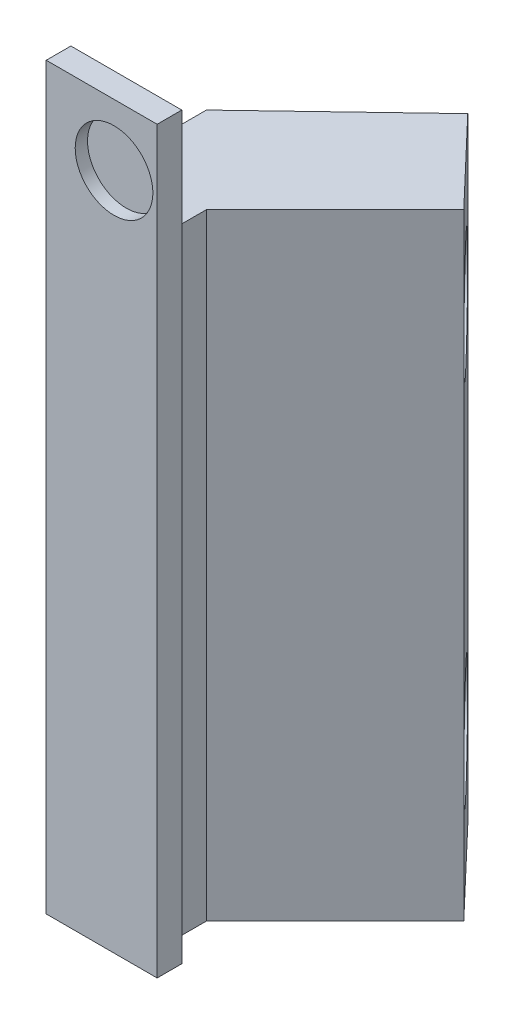
ISO-10303-21;
HEADER;
FILE_DESCRIPTION(('STEP AP214'),'2;1');
FILE_NAME('part.step','',(''),(''),'','','');
FILE_SCHEMA(('AUTOMOTIVE_DESIGN { 1 0 10303 214 1 1 1 1 }'));
ENDSEC;
DATA;
#1=APPLICATION_CONTEXT('core data for automotive mechanical design processes');
#2=APPLICATION_PROTOCOL_DEFINITION('international standard','automotive_design',2000,#1);
#3=PRODUCT_CONTEXT('',#1,'mechanical');
#4=PRODUCT('Part','Part','',(#3));
#5=PRODUCT_RELATED_PRODUCT_CATEGORY('part','',(#4));
#6=PRODUCT_DEFINITION_FORMATION('','',#4);
#7=PRODUCT_DEFINITION_CONTEXT('part definition',#1,'design');
#8=PRODUCT_DEFINITION('design','',#6,#7);
#9=PRODUCT_DEFINITION_SHAPE('','',#8);
#10=(LENGTH_UNIT() NAMED_UNIT(*) SI_UNIT(.MILLI.,.METRE.));
#11=(NAMED_UNIT(*) PLANE_ANGLE_UNIT() SI_UNIT($,.RADIAN.));
#12=(NAMED_UNIT(*) SI_UNIT($,.STERADIAN.) SOLID_ANGLE_UNIT());
#13=UNCERTAINTY_MEASURE_WITH_UNIT(LENGTH_MEASURE(1.E-05),#10,'distance_accuracy_value','');
#14=(GEOMETRIC_REPRESENTATION_CONTEXT(3) GLOBAL_UNCERTAINTY_ASSIGNED_CONTEXT((#13)) GLOBAL_UNIT_ASSIGNED_CONTEXT((#10,
#11,#12)) REPRESENTATION_CONTEXT('',''));
#15=CARTESIAN_POINT('',(0.,0.,0.));
#16=DIRECTION('',(0.,0.,1.));
#17=DIRECTION('',(1.,0.,0.));
#18=AXIS2_PLACEMENT_3D('',#15,#16,#17);
#19=CARTESIAN_POINT('',(-3.20062092340105,10.,2.64204287364237));
#20=DIRECTION('',(0.723861574835143,0.,-0.689945230056116));
#21=DIRECTION('',(-0.689945230056116,0.,-0.723861574835143));
#22=AXIS2_PLACEMENT_3D('',#19,#20,#21);
#23=CYLINDRICAL_SURFACE('',#22,2.5);
#24=CARTESIAN_POINT('',(0.,10.,-0.408613793443845));
#25=DIRECTION('',(1.,0.,0.));
#26=DIRECTION('',(0.,0.,-1.));
#27=AXIS2_PLACEMENT_3D('',#24,#25,#26);
#28=ELLIPSE('',#27,3.45369900394197,2.5);
#29=CARTESIAN_POINT('',(0.,10.,-3.86231279738582));
#30=VERTEX_POINT('',#29);
#31=EDGE_CURVE('E243',#30,#30,#28,.T.);
#32=ORIENTED_EDGE('',*,*,#31,.F.);
#33=EDGE_LOOP('',(#32));
#34=FACE_BOUND('',#33,.T.);
#35=CARTESIAN_POINT('',(13.4259640544104,10.,-13.2055078133467));
#36=DIRECTION('',(0.723861574835143,0.,-0.689945230056116));
#37=DIRECTION('',(-0.689945230056116,0.,-0.723861574835143));
#38=AXIS2_PLACEMENT_3D('',#35,#36,#37);
#39=CIRCLE('',#38,2.5);
#40=CARTESIAN_POINT('',(11.7011009792701,10.,-15.0151617504346));
#41=VERTEX_POINT('',#40);
#42=EDGE_CURVE('E250',#41,#41,#39,.T.);
#43=ORIENTED_EDGE('',*,*,#42,.T.);
#44=EDGE_LOOP('',(#43));
#45=FACE_BOUND('',#44,.T.);
#46=ADVANCED_FACE('F35',(#34,#45),#23,.F.);
#47=CARTESIAN_POINT('',(-3.20062092340105,40.,2.64204287364237));
#48=DIRECTION('',(0.723861574835143,0.,-0.689945230056116));
#49=DIRECTION('',(-0.689945230056116,0.,-0.723861574835143));
#50=AXIS2_PLACEMENT_3D('',#47,#48,#49);
#51=CYLINDRICAL_SURFACE('',#50,2.5);
#52=CARTESIAN_POINT('',(0.,40.,-0.40861379344384));
#53=DIRECTION('',(1.,0.,0.));
#54=DIRECTION('',(0.,0.,-1.));
#55=AXIS2_PLACEMENT_3D('',#52,#53,#54);
#56=ELLIPSE('',#55,3.45369900394197,2.5);
#57=CARTESIAN_POINT('',(0.,40.,-3.86231279738581));
#58=VERTEX_POINT('',#57);
#59=EDGE_CURVE('E240',#58,#58,#56,.T.);
#60=ORIENTED_EDGE('',*,*,#59,.F.);
#61=EDGE_LOOP('',(#60));
#62=FACE_BOUND('',#61,.T.);
#63=CARTESIAN_POINT('',(13.4259640544104,40.,-13.2055078133467));
#64=DIRECTION('',(0.723861574835143,0.,-0.689945230056116));
#65=DIRECTION('',(-0.689945230056116,0.,-0.723861574835143));
#66=AXIS2_PLACEMENT_3D('',#63,#64,#65);
#67=CIRCLE('',#66,2.5);
#68=CARTESIAN_POINT('',(11.7011009792701,40.,-15.0151617504346));
#69=VERTEX_POINT('',#68);
#70=EDGE_CURVE('E259',#69,#69,#67,.T.);
#71=ORIENTED_EDGE('',*,*,#70,.T.);
#72=EDGE_LOOP('',(#71));
#73=FACE_BOUND('',#72,.T.);
#74=ADVANCED_FACE('F265',(#62,#73),#51,.F.);
#75=CARTESIAN_POINT('',(2.,50.,2.));
#76=DIRECTION('',(-1.,0.,0.));
#77=DIRECTION('',(0.,0.,1.));
#78=AXIS2_PLACEMENT_3D('',#75,#76,#77);
#79=PLANE('',#78);
#80=DIRECTION('',(0.,0.,-1.));
#81=VECTOR('',#80,1.);
#82=CARTESIAN_POINT('',(2.,1.,4.));
#83=LINE('',#82,#81);
#84=CARTESIAN_POINT('',(2.,1.,4.));
#85=VERTEX_POINT('',#84);
#86=CARTESIAN_POINT('',(2.,1.,2.));
#87=VERTEX_POINT('',#86);
#88=EDGE_CURVE('E238',#85,#87,#83,.T.);
#89=ORIENTED_EDGE('',*,*,#88,.T.);
#90=DIRECTION('',(0.,-1.,0.));
#91=VECTOR('',#90,1.);
#92=CARTESIAN_POINT('',(2.,50.,2.));
#93=LINE('',#92,#91);
#94=CARTESIAN_POINT('',(2.,50.,2.));
#95=VERTEX_POINT('',#94);
#96=EDGE_CURVE('E209',#95,#87,#93,.T.);
#97=ORIENTED_EDGE('',*,*,#96,.F.);
#98=DIRECTION('',(0.,0.,-1.));
#99=VECTOR('',#98,1.);
#100=CARTESIAN_POINT('',(2.,50.,2.));
#101=LINE('',#100,#99);
#102=CARTESIAN_POINT('',(2.,50.,4.));
#103=VERTEX_POINT('',#102);
#104=EDGE_CURVE('E135',#103,#95,#101,.T.);
#105=ORIENTED_EDGE('',*,*,#104,.F.);
#106=DIRECTION('',(0.,-1.,0.));
#107=VECTOR('',#106,1.);
#108=CARTESIAN_POINT('',(2.,50.,4.));
#109=LINE('',#108,#107);
#110=EDGE_CURVE('E212',#103,#85,#109,.T.);
#111=ORIENTED_EDGE('',*,*,#110,.T.);
#112=EDGE_LOOP('',(#89,#97,#105,#111));
#113=FACE_BOUND('',#112,.T.);
#114=ADVANCED_FACE('F298',(#113),#79,.F.);
#115=CARTESIAN_POINT('',(7.,50.,2.));
#116=DIRECTION('',(0.,0.,-1.));
#117=DIRECTION('',(-1.,0.,0.));
#118=AXIS2_PLACEMENT_3D('',#115,#116,#117);
#119=PLANE('',#118);
#120=DIRECTION('',(1.,0.,0.));
#121=VECTOR('',#120,1.);
#122=CARTESIAN_POINT('',(2.,1.,2.));
#123=LINE('',#122,#121);
#124=CARTESIAN_POINT('',(7.,1.,2.));
#125=VERTEX_POINT('',#124);
#126=EDGE_CURVE('E236',#87,#125,#123,.T.);
#127=ORIENTED_EDGE('',*,*,#126,.T.);
#128=DIRECTION('',(0.,-1.,0.));
#129=VECTOR('',#128,1.);
#130=CARTESIAN_POINT('',(7.,50.,2.));
#131=LINE('',#130,#129);
#132=CARTESIAN_POINT('',(7.,50.,2.));
#133=VERTEX_POINT('',#132);
#134=EDGE_CURVE('E206',#133,#125,#131,.T.);
#135=ORIENTED_EDGE('',*,*,#134,.F.);
#136=DIRECTION('',(1.,0.,0.));
#137=VECTOR('',#136,1.);
#138=CARTESIAN_POINT('',(7.,50.,2.));
#139=LINE('',#138,#137);
#140=EDGE_CURVE('E191',#95,#133,#139,.T.);
#141=ORIENTED_EDGE('',*,*,#140,.F.);
#142=ORIENTED_EDGE('',*,*,#96,.T.);
#143=EDGE_LOOP('',(#127,#135,#141,#142));
#144=FACE_BOUND('',#143,.T.);
#145=ADVANCED_FACE('F302',(#144),#119,.F.);
#146=CARTESIAN_POINT('',(0.,50.,0.));
#147=DIRECTION('',(1.,0.,0.));
#148=DIRECTION('',(0.,0.,-1.));
#149=AXIS2_PLACEMENT_3D('',#146,#147,#148);
#150=PLANE('',#149);
#151=ORIENTED_EDGE('',*,*,#59,.T.);
#152=EDGE_LOOP('',(#151));
#153=FACE_BOUND('',#152,.T.);
#154=ORIENTED_EDGE('',*,*,#31,.T.);
#155=EDGE_LOOP('',(#154));
#156=FACE_BOUND('',#155,.T.);
#157=DIRECTION('',(0.,0.,1.));
#158=VECTOR('',#157,1.);
#159=CARTESIAN_POINT('',(0.,0.,0.));
#160=LINE('',#159,#158);
#161=CARTESIAN_POINT('',(0.,0.,-7.));
#162=VERTEX_POINT('',#161);
#163=CARTESIAN_POINT('',(0.,0.,6.));
#164=VERTEX_POINT('',#163);
#165=EDGE_CURVE('E188',#162,#164,#160,.T.);
#166=ORIENTED_EDGE('',*,*,#165,.T.);
#167=DIRECTION('',(0.,-1.,0.));
#168=VECTOR('',#167,1.);
#169=CARTESIAN_POINT('',(0.,50.,6.));
#170=LINE('',#169,#168);
#171=CARTESIAN_POINT('',(0.,60.,6.));
#172=VERTEX_POINT('',#171);
#173=EDGE_CURVE('E11',#172,#164,#170,.T.);
#174=ORIENTED_EDGE('',*,*,#173,.F.);
#175=DIRECTION('',(0.,0.,1.));
#176=VECTOR('',#175,1.);
#177=CARTESIAN_POINT('',(0.,60.,0.));
#178=LINE('',#177,#176);
#179=CARTESIAN_POINT('',(0.,60.,4.));
#180=VERTEX_POINT('',#179);
#181=EDGE_CURVE('E178',#180,#172,#178,.T.);
#182=ORIENTED_EDGE('',*,*,#181,.F.);
#183=DIRECTION('',(0.,-1.,0.));
#184=VECTOR('',#183,1.);
#185=CARTESIAN_POINT('',(0.,60.,4.));
#186=LINE('',#185,#184);
#187=CARTESIAN_POINT('',(0.,50.,4.));
#188=VERTEX_POINT('',#187);
#189=EDGE_CURVE('E130',#180,#188,#186,.T.);
#190=ORIENTED_EDGE('',*,*,#189,.T.);
#191=DIRECTION('',(0.,0.,1.));
#192=VECTOR('',#191,1.);
#193=CARTESIAN_POINT('',(0.,50.,0.));
#194=LINE('',#193,#192);
#195=CARTESIAN_POINT('',(0.,50.,-7.));
#196=VERTEX_POINT('',#195);
#197=EDGE_CURVE('E125',#196,#188,#194,.T.);
#198=ORIENTED_EDGE('',*,*,#197,.F.);
#199=DIRECTION('',(0.,-1.,0.));
#200=VECTOR('',#199,1.);
#201=CARTESIAN_POINT('',(0.,50.,-7.));
#202=LINE('',#201,#200);
#203=EDGE_CURVE('E127',#196,#162,#202,.T.);
#204=ORIENTED_EDGE('',*,*,#203,.T.);
#205=EDGE_LOOP('',(#166,#174,#182,#190,#198,#204));
#206=FACE_BOUND('',#205,.T.);
#207=ADVANCED_FACE('F37',(#153,#156,#206),#150,.F.);
#208=CARTESIAN_POINT('',(0.,50.,6.));
#209=DIRECTION('',(0.,0.,-1.));
#210=DIRECTION('',(-1.,0.,0.));
#211=AXIS2_PLACEMENT_3D('',#208,#209,#210);
#212=PLANE('',#211);
#213=CARTESIAN_POINT('',(5.5,55.,6.));
#214=DIRECTION('',(0.,0.,-1.));
#215=DIRECTION('',(-1.,0.,0.));
#216=AXIS2_PLACEMENT_3D('',#213,#214,#215);
#217=CIRCLE('',#216,3.15);
#218=CARTESIAN_POINT('',(2.35,55.,6.));
#219=VERTEX_POINT('',#218);
#220=EDGE_CURVE('E167',#219,#219,#217,.T.);
#221=ORIENTED_EDGE('',*,*,#220,.T.);
#222=EDGE_LOOP('',(#221));
#223=FACE_BOUND('',#222,.T.);
#224=DIRECTION('',(1.,0.,0.));
#225=VECTOR('',#224,1.);
#226=CARTESIAN_POINT('',(0.,0.,6.));
#227=LINE('',#226,#225);
#228=CARTESIAN_POINT('',(9.,0.,6.));
#229=VERTEX_POINT('',#228);
#230=EDGE_CURVE('E197',#164,#229,#227,.T.);
#231=ORIENTED_EDGE('',*,*,#230,.T.);
#232=DIRECTION('',(0.,-1.,0.));
#233=VECTOR('',#232,1.);
#234=CARTESIAN_POINT('',(9.,50.,6.));
#235=LINE('',#234,#233);
#236=CARTESIAN_POINT('',(9.,60.,6.));
#237=VERTEX_POINT('',#236);
#238=EDGE_CURVE('E43',#237,#229,#235,.T.);
#239=ORIENTED_EDGE('',*,*,#238,.F.);
#240=DIRECTION('',(1.,0.,0.));
#241=VECTOR('',#240,1.);
#242=CARTESIAN_POINT('',(0.,60.,6.));
#243=LINE('',#242,#241);
#244=EDGE_CURVE('E181',#172,#237,#243,.T.);
#245=ORIENTED_EDGE('',*,*,#244,.F.);
#246=ORIENTED_EDGE('',*,*,#173,.T.);
#247=EDGE_LOOP('',(#231,#239,#245,#246));
#248=FACE_BOUND('',#247,.T.);
#249=ADVANCED_FACE('F290',(#223,#248),#212,.F.);
#250=CARTESIAN_POINT('',(9.,50.,6.));
#251=DIRECTION('',(-1.,0.,0.));
#252=DIRECTION('',(0.,0.,1.));
#253=AXIS2_PLACEMENT_3D('',#250,#251,#252);
#254=PLANE('',#253);
#255=DIRECTION('',(0.,0.,-1.));
#256=VECTOR('',#255,1.);
#257=CARTESIAN_POINT('',(9.,0.,6.));
#258=LINE('',#257,#256);
#259=CARTESIAN_POINT('',(9.,0.,4.));
#260=VERTEX_POINT('',#259);
#261=EDGE_CURVE('E199',#229,#260,#258,.T.);
#262=ORIENTED_EDGE('',*,*,#261,.T.);
#263=DIRECTION('',(0.,-1.,0.));
#264=VECTOR('',#263,1.);
#265=CARTESIAN_POINT('',(9.,50.,4.));
#266=LINE('',#265,#264);
#267=CARTESIAN_POINT('',(9.,60.,4.));
#268=VERTEX_POINT('',#267);
#269=EDGE_CURVE('E214',#268,#260,#266,.T.);
#270=ORIENTED_EDGE('',*,*,#269,.F.);
#271=DIRECTION('',(0.,0.,-1.));
#272=VECTOR('',#271,1.);
#273=CARTESIAN_POINT('',(9.,60.,0.));
#274=LINE('',#273,#272);
#275=EDGE_CURVE('E184',#237,#268,#274,.T.);
#276=ORIENTED_EDGE('',*,*,#275,.F.);
#277=ORIENTED_EDGE('',*,*,#238,.T.);
#278=EDGE_LOOP('',(#262,#270,#276,#277));
#279=FACE_BOUND('',#278,.T.);
#280=ADVANCED_FACE('F220',(#279),#254,.F.);
#281=CARTESIAN_POINT('',(9.,50.,4.));
#282=DIRECTION('',(0.,0.,1.));
#283=DIRECTION('',(1.,0.,0.));
#284=AXIS2_PLACEMENT_3D('',#281,#282,#283);
#285=PLANE('',#284);
#286=DIRECTION('',(-1.,0.,0.));
#287=VECTOR('',#286,1.);
#288=CARTESIAN_POINT('',(9.,0.,4.));
#289=LINE('',#288,#287);
#290=CARTESIAN_POINT('',(7.,0.,4.));
#291=VERTEX_POINT('',#290);
#292=EDGE_CURVE('E201',#260,#291,#289,.T.);
#293=ORIENTED_EDGE('',*,*,#292,.T.);
#294=DIRECTION('',(0.,-1.,0.));
#295=VECTOR('',#294,1.);
#296=CARTESIAN_POINT('',(7.,1.,4.));
#297=LINE('',#296,#295);
#298=CARTESIAN_POINT('',(7.,1.,4.));
#299=VERTEX_POINT('',#298);
#300=EDGE_CURVE('E50',#299,#291,#297,.T.);
#301=ORIENTED_EDGE('',*,*,#300,.F.);
#302=DIRECTION('',(-1.,0.,0.));
#303=VECTOR('',#302,1.);
#304=CARTESIAN_POINT('',(2.,1.,4.));
#305=LINE('',#304,#303);
#306=EDGE_CURVE('E55',#299,#85,#305,.T.);
#307=ORIENTED_EDGE('',*,*,#306,.T.);
#308=ORIENTED_EDGE('',*,*,#110,.F.);
#309=DIRECTION('',(1.,0.,0.));
#310=VECTOR('',#309,1.);
#311=CARTESIAN_POINT('',(0.,50.,4.));
#312=LINE('',#311,#310);
#313=EDGE_CURVE('E172',#188,#103,#312,.T.);
#314=ORIENTED_EDGE('',*,*,#313,.F.);
#315=ORIENTED_EDGE('',*,*,#189,.F.);
#316=DIRECTION('',(1.,0.,0.));
#317=VECTOR('',#316,1.);
#318=CARTESIAN_POINT('',(0.,60.,4.));
#319=LINE('',#318,#317);
#320=EDGE_CURVE('E175',#180,#268,#319,.T.);
#321=ORIENTED_EDGE('',*,*,#320,.T.);
#322=ORIENTED_EDGE('',*,*,#269,.T.);
#323=EDGE_LOOP('',(#293,#301,#307,#308,#314,#315,#321,#322));
#324=FACE_BOUND('',#323,.T.);
#325=ADVANCED_FACE('F227',(#324),#285,.F.);
#326=CARTESIAN_POINT('',(7.,50.,0.));
#327=DIRECTION('',(-1.,0.,0.));
#328=DIRECTION('',(0.,0.,1.));
#329=AXIS2_PLACEMENT_3D('',#326,#327,#328);
#330=PLANE('',#329);
#331=DIRECTION('',(0.,0.,-1.));
#332=VECTOR('',#331,1.);
#333=CARTESIAN_POINT('',(7.,0.,0.));
#334=LINE('',#333,#332);
#335=CARTESIAN_POINT('',(7.,0.,0.));
#336=VERTEX_POINT('',#335);
#337=EDGE_CURVE('E136',#291,#336,#334,.T.);
#338=ORIENTED_EDGE('',*,*,#337,.T.);
#339=DIRECTION('',(0.,-1.,0.));
#340=VECTOR('',#339,1.);
#341=CARTESIAN_POINT('',(7.,50.,0.));
#342=LINE('',#341,#340);
#343=CARTESIAN_POINT('',(7.,50.,0.));
#344=VERTEX_POINT('',#343);
#345=EDGE_CURVE('E195',#344,#336,#342,.T.);
#346=ORIENTED_EDGE('',*,*,#345,.F.);
#347=DIRECTION('',(0.,0.,-1.));
#348=VECTOR('',#347,1.);
#349=CARTESIAN_POINT('',(7.,50.,0.));
#350=LINE('',#349,#348);
#351=EDGE_CURVE('E193',#133,#344,#350,.T.);
#352=ORIENTED_EDGE('',*,*,#351,.F.);
#353=ORIENTED_EDGE('',*,*,#134,.T.);
#354=DIRECTION('',(0.,0.,1.));
#355=VECTOR('',#354,1.);
#356=CARTESIAN_POINT('',(7.,1.,4.));
#357=LINE('',#356,#355);
#358=EDGE_CURVE('E232',#125,#299,#357,.T.);
#359=ORIENTED_EDGE('',*,*,#358,.T.);
#360=ORIENTED_EDGE('',*,*,#300,.T.);
#361=EDGE_LOOP('',(#338,#346,#352,#353,#359,#360));
#362=FACE_BOUND('',#361,.T.);
#363=ADVANCED_FACE('F229',(#362),#330,.F.);
#364=CARTESIAN_POINT('',(0.,50.,0.));
#365=DIRECTION('',(0.,-1.,0.));
#366=DIRECTION('',(0.,0.,-1.));
#367=AXIS2_PLACEMENT_3D('',#364,#365,#366);
#368=PLANE('',#367);
#369=ORIENTED_EDGE('',*,*,#197,.T.);
#370=ORIENTED_EDGE('',*,*,#313,.T.);
#371=ORIENTED_EDGE('',*,*,#104,.T.);
#372=ORIENTED_EDGE('',*,*,#140,.T.);
#373=ORIENTED_EDGE('',*,*,#351,.T.);
#374=DIRECTION('',(-0.707106781186547,0.,0.707106781186548));
#375=VECTOR('',#374,1.);
#376=CARTESIAN_POINT('',(3.5,50.,3.5));
#377=LINE('',#376,#375);
#378=CARTESIAN_POINT('',(17.4417276359639,50.,-10.4417276359639));
#379=VERTEX_POINT('',#378);
#380=EDGE_CURVE('E151',#379,#344,#377,.T.);
#381=ORIENTED_EDGE('',*,*,#380,.F.);
#382=DIRECTION('',(0.689945230056116,0.,0.723861574835143));
#383=VECTOR('',#382,1.);
#384=CARTESIAN_POINT('',(14.3538975079761,50.,-13.681349394182));
#385=LINE('',#384,#383);
#386=CARTESIAN_POINT('',(10.8579236225271,50.,-17.3491784508417));
#387=VERTEX_POINT('',#386);
#388=EDGE_CURVE('E146',#387,#379,#385,.T.);
#389=ORIENTED_EDGE('',*,*,#388,.F.);
#390=DIRECTION('',(0.723861574835143,0.,-0.689945230056116));
#391=VECTOR('',#390,1.);
#392=CARTESIAN_POINT('',(-3.49597388544891,50.,-3.6678290566597));
#393=LINE('',#392,#391);
#394=EDGE_CURVE('E141',#196,#387,#393,.T.);
#395=ORIENTED_EDGE('',*,*,#394,.F.);
#396=EDGE_LOOP('',(#369,#370,#371,#372,#373,#381,#389,#395));
#397=FACE_BOUND('',#396,.T.);
#398=ADVANCED_FACE('F148',(#397),#368,.F.);
#399=CARTESIAN_POINT('',(0.,0.,0.));
#400=DIRECTION('',(0.,-1.,0.));
#401=DIRECTION('',(0.,0.,-1.));
#402=AXIS2_PLACEMENT_3D('',#399,#400,#401);
#403=PLANE('',#402);
#404=ORIENTED_EDGE('',*,*,#165,.F.);
#405=DIRECTION('',(0.723861574835143,0.,-0.689945230056116));
#406=VECTOR('',#405,1.);
#407=CARTESIAN_POINT('',(-3.49597388544891,0.,-3.6678290566597));
#408=LINE('',#407,#406);
#409=CARTESIAN_POINT('',(10.8579236225271,0.,-17.3491784508417));
#410=VERTEX_POINT('',#409);
#411=EDGE_CURVE('E144',#162,#410,#408,.T.);
#412=ORIENTED_EDGE('',*,*,#411,.T.);
#413=DIRECTION('',(0.689945230056116,0.,0.723861574835143));
#414=VECTOR('',#413,1.);
#415=CARTESIAN_POINT('',(14.3538975079761,0.,-13.681349394182));
#416=LINE('',#415,#414);
#417=CARTESIAN_POINT('',(17.4417276359639,0.,-10.4417276359639));
#418=VERTEX_POINT('',#417);
#419=EDGE_CURVE('E155',#410,#418,#416,.T.);
#420=ORIENTED_EDGE('',*,*,#419,.T.);
#421=DIRECTION('',(-0.707106781186547,0.,0.707106781186548));
#422=VECTOR('',#421,1.);
#423=CARTESIAN_POINT('',(3.5,0.,3.5));
#424=LINE('',#423,#422);
#425=EDGE_CURVE('E159',#418,#336,#424,.T.);
#426=ORIENTED_EDGE('',*,*,#425,.T.);
#427=ORIENTED_EDGE('',*,*,#337,.F.);
#428=ORIENTED_EDGE('',*,*,#292,.F.);
#429=ORIENTED_EDGE('',*,*,#261,.F.);
#430=ORIENTED_EDGE('',*,*,#230,.F.);
#431=EDGE_LOOP('',(#404,#412,#420,#426,#427,#428,#429,#430));
#432=FACE_BOUND('',#431,.T.);
#433=ADVANCED_FACE('F226',(#432),#403,.T.);
#434=CARTESIAN_POINT('',(0.,60.,0.));
#435=DIRECTION('',(0.,1.,0.));
#436=DIRECTION('',(0.,0.,1.));
#437=AXIS2_PLACEMENT_3D('',#434,#435,#436);
#438=PLANE('',#437);
#439=ORIENTED_EDGE('',*,*,#320,.F.);
#440=ORIENTED_EDGE('',*,*,#181,.T.);
#441=ORIENTED_EDGE('',*,*,#244,.T.);
#442=ORIENTED_EDGE('',*,*,#275,.T.);
#443=EDGE_LOOP('',(#439,#440,#441,#442));
#444=FACE_BOUND('',#443,.T.);
#445=ADVANCED_FACE('F293',(#444),#438,.T.);
#446=CARTESIAN_POINT('',(5.5,55.,5.));
#447=DIRECTION('',(0.,0.,1.));
#448=DIRECTION('',(1.,0.,0.));
#449=AXIS2_PLACEMENT_3D('',#446,#447,#448);
#450=CYLINDRICAL_SURFACE('',#449,3.15);
#451=CARTESIAN_POINT('',(5.5,55.,5.));
#452=DIRECTION('',(0.,0.,-1.));
#453=DIRECTION('',(-1.,0.,0.));
#454=AXIS2_PLACEMENT_3D('',#451,#452,#453);
#455=CIRCLE('',#454,3.15);
#456=CARTESIAN_POINT('',(2.35,55.,5.));
#457=VERTEX_POINT('',#456);
#458=EDGE_CURVE('E169',#457,#457,#455,.T.);
#459=ORIENTED_EDGE('',*,*,#458,.T.);
#460=EDGE_LOOP('',(#459));
#461=FACE_BOUND('',#460,.T.);
#462=ORIENTED_EDGE('',*,*,#220,.F.);
#463=EDGE_LOOP('',(#462));
#464=FACE_BOUND('',#463,.T.);
#465=ADVANCED_FACE('F311',(#461,#464),#450,.F.);
#466=CARTESIAN_POINT('',(5.5,55.,5.));
#467=DIRECTION('',(0.,0.,-1.));
#468=DIRECTION('',(-1.,0.,0.));
#469=AXIS2_PLACEMENT_3D('',#466,#467,#468);
#470=PLANE('',#469);
#471=ORIENTED_EDGE('',*,*,#458,.F.);
#472=EDGE_LOOP('',(#471));
#473=FACE_BOUND('',#472,.T.);
#474=ADVANCED_FACE('F306',(#473),#470,.F.);
#475=CARTESIAN_POINT('',(3.5,50.,3.5));
#476=DIRECTION('',(0.707106781186548,0.,0.707106781186547));
#477=DIRECTION('',(0.707106781186547,0.,-0.707106781186548));
#478=AXIS2_PLACEMENT_3D('',#475,#476,#477);
#479=PLANE('',#478);
#480=ORIENTED_EDGE('',*,*,#425,.F.);
#481=DIRECTION('',(0.,-1.,0.));
#482=VECTOR('',#481,1.);
#483=CARTESIAN_POINT('',(17.4417276359639,50.,-10.4417276359639));
#484=LINE('',#483,#482);
#485=EDGE_CURVE('E165',#379,#418,#484,.T.);
#486=ORIENTED_EDGE('',*,*,#485,.F.);
#487=ORIENTED_EDGE('',*,*,#380,.T.);
#488=ORIENTED_EDGE('',*,*,#345,.T.);
#489=EDGE_LOOP('',(#480,#486,#487,#488));
#490=FACE_BOUND('',#489,.T.);
#491=ADVANCED_FACE('F284',(#490),#479,.T.);
#492=CARTESIAN_POINT('',(14.3538975079761,50.,-13.681349394182));
#493=DIRECTION('',(0.723861574835143,0.,-0.689945230056116));
#494=DIRECTION('',(-0.689945230056116,0.,-0.723861574835143));
#495=AXIS2_PLACEMENT_3D('',#492,#493,#494);
#496=PLANE('',#495);
#497=CARTESIAN_POINT('',(14.1498256292455,40.,-13.8954530434028));
#498=DIRECTION('',(0.723861574835143,0.,-0.689945230056116));
#499=DIRECTION('',(-0.689945230056116,0.,-0.723861574835143));
#500=AXIS2_PLACEMENT_3D('',#497,#498,#499);
#501=CIRCLE('',#500,4.5);
#502=CARTESIAN_POINT('',(11.045072093993,40.,-17.152830130161));
#503=VERTEX_POINT('',#502);
#504=EDGE_CURVE('E254',#503,#503,#501,.T.);
#505=ORIENTED_EDGE('',*,*,#504,.F.);
#506=EDGE_LOOP('',(#505));
#507=FACE_BOUND('',#506,.T.);
#508=CARTESIAN_POINT('',(14.1498256292455,10.,-13.8954530434028));
#509=DIRECTION('',(0.723861574835143,0.,-0.689945230056116));
#510=DIRECTION('',(-0.689945230056116,0.,-0.723861574835143));
#511=AXIS2_PLACEMENT_3D('',#508,#509,#510);
#512=CIRCLE('',#511,4.5);
#513=CARTESIAN_POINT('',(11.045072093993,10.,-17.152830130161));
#514=VERTEX_POINT('',#513);
#515=EDGE_CURVE('E247',#514,#514,#512,.T.);
#516=ORIENTED_EDGE('',*,*,#515,.F.);
#517=EDGE_LOOP('',(#516));
#518=FACE_BOUND('',#517,.T.);
#519=ORIENTED_EDGE('',*,*,#419,.F.);
#520=DIRECTION('',(0.,-1.,0.));
#521=VECTOR('',#520,1.);
#522=CARTESIAN_POINT('',(10.8579236225271,50.,-17.3491784508417));
#523=LINE('',#522,#521);
#524=EDGE_CURVE('E145',#387,#410,#523,.T.);
#525=ORIENTED_EDGE('',*,*,#524,.F.);
#526=ORIENTED_EDGE('',*,*,#388,.T.);
#527=ORIENTED_EDGE('',*,*,#485,.T.);
#528=EDGE_LOOP('',(#519,#525,#526,#527));
#529=FACE_BOUND('',#528,.T.);
#530=ADVANCED_FACE('F281',(#507,#518,#529),#496,.T.);
#531=CARTESIAN_POINT('',(-3.49597388544891,50.,-3.6678290566597));
#532=DIRECTION('',(-0.689945230056116,0.,-0.723861574835143));
#533=DIRECTION('',(-0.723861574835143,0.,0.689945230056116));
#534=AXIS2_PLACEMENT_3D('',#531,#532,#533);
#535=PLANE('',#534);
#536=ORIENTED_EDGE('',*,*,#411,.F.);
#537=ORIENTED_EDGE('',*,*,#203,.F.);
#538=ORIENTED_EDGE('',*,*,#394,.T.);
#539=ORIENTED_EDGE('',*,*,#524,.T.);
#540=EDGE_LOOP('',(#536,#537,#538,#539));
#541=FACE_BOUND('',#540,.T.);
#542=ADVANCED_FACE('F140',(#541),#535,.T.);
#543=CARTESIAN_POINT('',(0.,1.,0.));
#544=DIRECTION('',(0.,-1.,0.));
#545=DIRECTION('',(0.,0.,-1.));
#546=AXIS2_PLACEMENT_3D('',#543,#544,#545);
#547=PLANE('',#546);
#548=ORIENTED_EDGE('',*,*,#88,.F.);
#549=ORIENTED_EDGE('',*,*,#306,.F.);
#550=ORIENTED_EDGE('',*,*,#358,.F.);
#551=ORIENTED_EDGE('',*,*,#126,.F.);
#552=EDGE_LOOP('',(#548,#549,#550,#551));
#553=FACE_BOUND('',#552,.T.);
#554=ADVANCED_FACE('F277',(#553),#547,.F.);
#555=CARTESIAN_POINT('',(13.4259640544104,40.,-13.2055078133467));
#556=DIRECTION('',(0.723861574835143,0.,-0.689945230056116));
#557=DIRECTION('',(-0.689945230056116,0.,-0.723861574835143));
#558=AXIS2_PLACEMENT_3D('',#555,#556,#557);
#559=CYLINDRICAL_SURFACE('',#558,4.5);
#560=CARTESIAN_POINT('',(13.4259640544104,40.,-13.2055078133467));
#561=DIRECTION('',(0.723861574835143,0.,-0.689945230056116));
#562=DIRECTION('',(-0.689945230056116,0.,-0.723861574835143));
#563=AXIS2_PLACEMENT_3D('',#560,#561,#562);
#564=CIRCLE('',#563,4.5);
#565=CARTESIAN_POINT('',(10.3212105191578,40.,-16.4628849001048));
#566=VERTEX_POINT('',#565);
#567=EDGE_CURVE('E246',#566,#566,#564,.T.);
#568=ORIENTED_EDGE('',*,*,#567,.F.);
#569=EDGE_LOOP('',(#568));
#570=FACE_BOUND('',#569,.T.);
#571=ORIENTED_EDGE('',*,*,#504,.T.);
#572=EDGE_LOOP('',(#571));
#573=FACE_BOUND('',#572,.T.);
#574=ADVANCED_FACE('F271',(#570,#573),#559,.F.);
#575=CARTESIAN_POINT('',(13.6300359331409,0.,-12.9914041641259));
#576=DIRECTION('',(0.723861574835143,0.,-0.689945230056116));
#577=DIRECTION('',(-0.689945230056116,0.,-0.723861574835143));
#578=AXIS2_PLACEMENT_3D('',#575,#576,#577);
#579=PLANE('',#578);
#580=ORIENTED_EDGE('',*,*,#70,.F.);
#581=EDGE_LOOP('',(#580));
#582=FACE_BOUND('',#581,.T.);
#583=ORIENTED_EDGE('',*,*,#567,.T.);
#584=EDGE_LOOP('',(#583));
#585=FACE_BOUND('',#584,.T.);
#586=ADVANCED_FACE('F267',(#582,#585),#579,.T.);
#587=CARTESIAN_POINT('',(13.4259640544104,10.,-13.2055078133467));
#588=DIRECTION('',(0.723861574835143,0.,-0.689945230056116));
#589=DIRECTION('',(-0.689945230056116,0.,-0.723861574835143));
#590=AXIS2_PLACEMENT_3D('',#587,#588,#589);
#591=CYLINDRICAL_SURFACE('',#590,4.5);
#592=CARTESIAN_POINT('',(13.4259640544104,10.,-13.2055078133467));
#593=DIRECTION('',(0.723861574835143,0.,-0.689945230056116));
#594=DIRECTION('',(-0.689945230056116,0.,-0.723861574835143));
#595=AXIS2_PLACEMENT_3D('',#592,#593,#594);
#596=CIRCLE('',#595,4.5);
#597=CARTESIAN_POINT('',(10.3212105191578,10.,-16.4628849001048));
#598=VERTEX_POINT('',#597);
#599=EDGE_CURVE('E251',#598,#598,#596,.T.);
#600=ORIENTED_EDGE('',*,*,#599,.F.);
#601=EDGE_LOOP('',(#600));
#602=FACE_BOUND('',#601,.T.);
#603=ORIENTED_EDGE('',*,*,#515,.T.);
#604=EDGE_LOOP('',(#603));
#605=FACE_BOUND('',#604,.T.);
#606=ADVANCED_FACE('F270',(#602,#605),#591,.F.);
#607=CARTESIAN_POINT('',(13.6300359331409,0.,-12.9914041641259));
#608=DIRECTION('',(0.723861574835143,0.,-0.689945230056116));
#609=DIRECTION('',(-0.689945230056116,0.,-0.723861574835143));
#610=AXIS2_PLACEMENT_3D('',#607,#608,#609);
#611=PLANE('',#610);
#612=ORIENTED_EDGE('',*,*,#42,.F.);
#613=EDGE_LOOP('',(#612));
#614=FACE_BOUND('',#613,.T.);
#615=ORIENTED_EDGE('',*,*,#599,.T.);
#616=EDGE_LOOP('',(#615));
#617=FACE_BOUND('',#616,.T.);
#618=ADVANCED_FACE('F355',(#614,#617),#611,.T.);
#619=CLOSED_SHELL('',(#46,#74,#114,#145,#207,#249,#280,#325,#363,#398,#433,#445,#465,#474,#491,
#530,#542,#554,#574,#586,#606,#618));
#620=MANIFOLD_SOLID_BREP('B2',#619);
#621=ADVANCED_BREP_SHAPE_REPRESENTATION('',(#18,#620),#14);
#622=SHAPE_DEFINITION_REPRESENTATION(#9,#621);
ENDSEC;
END-ISO-10303-21;
